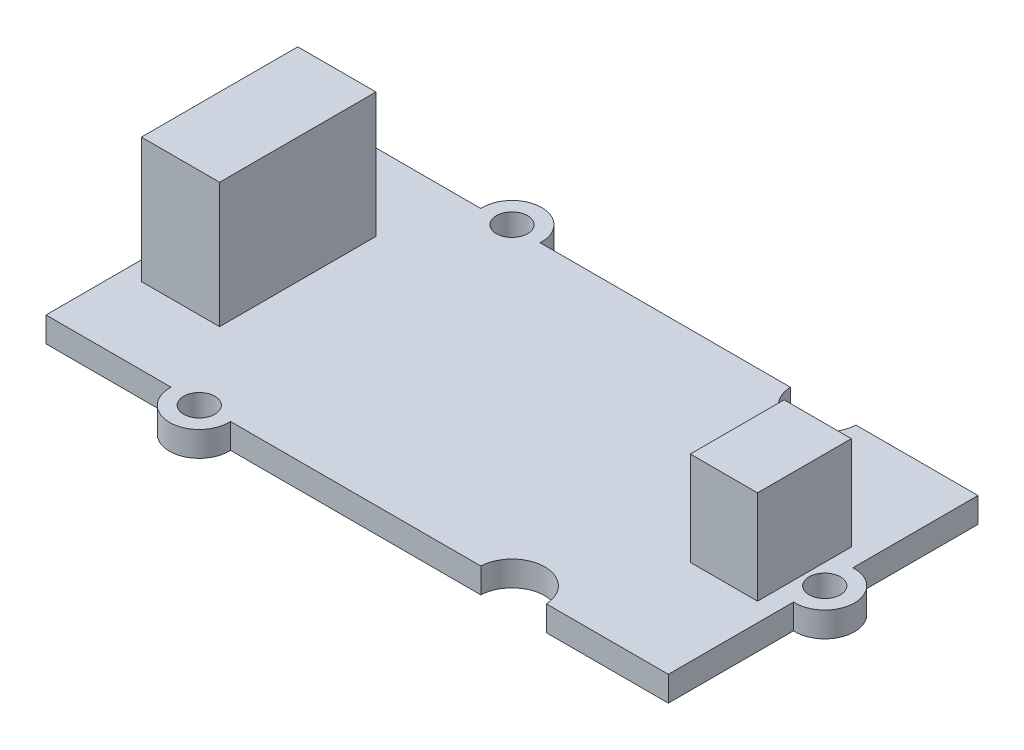
ISO-10303-21;
HEADER;
FILE_DESCRIPTION(('STEP AP214'),'2;1');
FILE_NAME('part.step','',(''),(''),'','','');
FILE_SCHEMA(('AUTOMOTIVE_DESIGN { 1 0 10303 214 1 1 1 1 }'));
ENDSEC;
DATA;
#1=APPLICATION_CONTEXT('core data for automotive mechanical design processes');
#2=APPLICATION_PROTOCOL_DEFINITION('international standard','automotive_design',2000,#1);
#3=PRODUCT_CONTEXT('',#1,'mechanical');
#4=PRODUCT('Part','Part','',(#3));
#5=PRODUCT_RELATED_PRODUCT_CATEGORY('part','',(#4));
#6=PRODUCT_DEFINITION_FORMATION('','',#4);
#7=PRODUCT_DEFINITION_CONTEXT('part definition',#1,'design');
#8=PRODUCT_DEFINITION('design','',#6,#7);
#9=PRODUCT_DEFINITION_SHAPE('','',#8);
#10=(LENGTH_UNIT() NAMED_UNIT(*) SI_UNIT(.MILLI.,.METRE.));
#11=(NAMED_UNIT(*) PLANE_ANGLE_UNIT() SI_UNIT($,.RADIAN.));
#12=(NAMED_UNIT(*) SI_UNIT($,.STERADIAN.) SOLID_ANGLE_UNIT());
#13=UNCERTAINTY_MEASURE_WITH_UNIT(LENGTH_MEASURE(1.E-05),#10,'distance_accuracy_value','');
#14=(GEOMETRIC_REPRESENTATION_CONTEXT(3) GLOBAL_UNCERTAINTY_ASSIGNED_CONTEXT((#13)) GLOBAL_UNIT_ASSIGNED_CONTEXT((#10,
#11,#12)) REPRESENTATION_CONTEXT('',''));
#15=CARTESIAN_POINT('',(0.,0.,0.));
#16=DIRECTION('',(0.,0.,1.));
#17=DIRECTION('',(1.,0.,0.));
#18=AXIS2_PLACEMENT_3D('',#15,#16,#17);
#19=CARTESIAN_POINT('',(0.,1.6,0.));
#20=DIRECTION('',(0.,-1.,0.));
#21=DIRECTION('',(0.,0.,-1.));
#22=AXIS2_PLACEMENT_3D('',#19,#20,#21);
#23=PLANE('',#22);
#24=DIRECTION('',(0.,0.,-1.));
#25=VECTOR('',#24,1.);
#26=CARTESIAN_POINT('',(18.7,1.6,3.));
#27=LINE('',#26,#25);
#28=CARTESIAN_POINT('',(18.7,1.6,3.));
#29=VERTEX_POINT('',#28);
#30=CARTESIAN_POINT('',(18.7,1.6,-3.));
#31=VERTEX_POINT('',#30);
#32=EDGE_CURVE('E227',#29,#31,#27,.T.);
#33=ORIENTED_EDGE('',*,*,#32,.F.);
#34=DIRECTION('',(1.,0.,0.));
#35=VECTOR('',#34,1.);
#36=CARTESIAN_POINT('',(14.4,1.6,3.));
#37=LINE('',#36,#35);
#38=CARTESIAN_POINT('',(14.4,1.6,3.));
#39=VERTEX_POINT('',#38);
#40=EDGE_CURVE('E239',#39,#29,#37,.T.);
#41=ORIENTED_EDGE('',*,*,#40,.F.);
#42=DIRECTION('',(0.,0.,1.));
#43=VECTOR('',#42,1.);
#44=CARTESIAN_POINT('',(14.4,1.6,3.));
#45=LINE('',#44,#43);
#46=CARTESIAN_POINT('',(14.4,1.6,-3.));
#47=VERTEX_POINT('',#46);
#48=EDGE_CURVE('E247',#47,#39,#45,.T.);
#49=ORIENTED_EDGE('',*,*,#48,.F.);
#50=DIRECTION('',(-1.,0.,0.));
#51=VECTOR('',#50,1.);
#52=CARTESIAN_POINT('',(14.4,1.6,-3.));
#53=LINE('',#52,#51);
#54=EDGE_CURVE('E58',#31,#47,#53,.T.);
#55=ORIENTED_EDGE('',*,*,#54,.F.);
#56=EDGE_LOOP('',(#33,#41,#49,#55));
#57=FACE_BOUND('',#56,.T.);
#58=CARTESIAN_POINT('',(-9.99999999999999,1.6,10.));
#59=DIRECTION('',(0.,1.,0.));
#60=DIRECTION('',(0.,0.,1.));
#61=AXIS2_PLACEMENT_3D('',#58,#59,#60);
#62=CIRCLE('',#61,0.999999999999999);
#63=CARTESIAN_POINT('',(-9.99999999999999,1.6,11.));
#64=VERTEX_POINT('',#63);
#65=EDGE_CURVE('E272',#64,#64,#62,.T.);
#66=ORIENTED_EDGE('',*,*,#65,.F.);
#67=EDGE_LOOP('',(#66));
#68=FACE_BOUND('',#67,.T.);
#69=CARTESIAN_POINT('',(20.,1.6,0.));
#70=DIRECTION('',(0.,1.,0.));
#71=DIRECTION('',(0.,0.,1.));
#72=AXIS2_PLACEMENT_3D('',#69,#70,#71);
#73=CIRCLE('',#72,1.);
#74=CARTESIAN_POINT('',(20.,1.6,1.));
#75=VERTEX_POINT('',#74);
#76=EDGE_CURVE('E269',#75,#75,#73,.T.);
#77=ORIENTED_EDGE('',*,*,#76,.F.);
#78=EDGE_LOOP('',(#77));
#79=FACE_BOUND('',#78,.T.);
#80=CARTESIAN_POINT('',(-10.,1.6,-10.));
#81=DIRECTION('',(0.,1.,0.));
#82=DIRECTION('',(0.,0.,1.));
#83=AXIS2_PLACEMENT_3D('',#80,#81,#82);
#84=CIRCLE('',#83,0.999999999999999);
#85=CARTESIAN_POINT('',(-10.,1.6,-9.));
#86=VERTEX_POINT('',#85);
#87=EDGE_CURVE('E279',#86,#86,#84,.T.);
#88=ORIENTED_EDGE('',*,*,#87,.F.);
#89=EDGE_LOOP('',(#88));
#90=FACE_BOUND('',#89,.T.);
#91=DIRECTION('',(0.,0.,1.));
#92=VECTOR('',#91,1.);
#93=CARTESIAN_POINT('',(-18.7,1.6,5.));
#94=LINE('',#93,#92);
#95=CARTESIAN_POINT('',(-18.7,1.6,-5.));
#96=VERTEX_POINT('',#95);
#97=CARTESIAN_POINT('',(-18.7,1.6,-1.64924225024706));
#98=VERTEX_POINT('',#97);
#99=EDGE_CURVE('E50',#96,#98,#94,.T.);
#100=ORIENTED_EDGE('',*,*,#99,.F.);
#101=DIRECTION('',(-1.,0.,0.));
#102=VECTOR('',#101,1.);
#103=CARTESIAN_POINT('',(-18.7,1.6,-5.));
#104=LINE('',#103,#102);
#105=CARTESIAN_POINT('',(-13.7,1.6,-5.));
#106=VERTEX_POINT('',#105);
#107=EDGE_CURVE('E447',#106,#96,#104,.T.);
#108=ORIENTED_EDGE('',*,*,#107,.F.);
#109=DIRECTION('',(0.,0.,-1.));
#110=VECTOR('',#109,1.);
#111=CARTESIAN_POINT('',(-13.7,1.6,5.));
#112=LINE('',#111,#110);
#113=CARTESIAN_POINT('',(-13.7,1.6,5.));
#114=VERTEX_POINT('',#113);
#115=EDGE_CURVE('E225',#114,#106,#112,.T.);
#116=ORIENTED_EDGE('',*,*,#115,.F.);
#117=DIRECTION('',(1.,0.,0.));
#118=VECTOR('',#117,1.);
#119=CARTESIAN_POINT('',(-18.7,1.6,5.));
#120=LINE('',#119,#118);
#121=CARTESIAN_POINT('',(-18.7,1.6,5.));
#122=VERTEX_POINT('',#121);
#123=EDGE_CURVE('E221',#122,#114,#120,.T.);
#124=ORIENTED_EDGE('',*,*,#123,.F.);
#125=CARTESIAN_POINT('',(-18.7,1.6,1.64924225024706));
#126=VERTEX_POINT('',#125);
#127=EDGE_CURVE('E439',#126,#122,#94,.T.);
#128=ORIENTED_EDGE('',*,*,#127,.F.);
#129=CARTESIAN_POINT('',(-20.,1.6,0.));
#130=DIRECTION('',(0.,1.,0.));
#131=DIRECTION('',(0.,0.,1.));
#132=AXIS2_PLACEMENT_3D('',#129,#130,#131);
#133=CIRCLE('',#132,2.1);
#134=CARTESIAN_POINT('',(-19.9,1.6,2.0976176963403));
#135=VERTEX_POINT('',#134);
#136=EDGE_CURVE('E284',#135,#126,#133,.T.);
#137=ORIENTED_EDGE('',*,*,#136,.F.);
#138=DIRECTION('',(0.,0.,1.));
#139=VECTOR('',#138,1.);
#140=CARTESIAN_POINT('',(-19.9,1.6,9.9));
#141=LINE('',#140,#139);
#142=CARTESIAN_POINT('',(-19.9,1.6,9.9));
#143=VERTEX_POINT('',#142);
#144=EDGE_CURVE('E351',#135,#143,#141,.T.);
#145=ORIENTED_EDGE('',*,*,#144,.T.);
#146=DIRECTION('',(1.,0.,0.));
#147=VECTOR('',#146,1.);
#148=CARTESIAN_POINT('',(-19.9,1.6,9.9));
#149=LINE('',#148,#147);
#150=CARTESIAN_POINT('',(-11.897366596101,1.6,9.9));
#151=VERTEX_POINT('',#150);
#152=EDGE_CURVE('E357',#143,#151,#149,.T.);
#153=ORIENTED_EDGE('',*,*,#152,.T.);
#154=CARTESIAN_POINT('',(-9.99999999999999,1.6,10.));
#155=DIRECTION('',(0.,-1.,0.));
#156=DIRECTION('',(0.,0.,-1.));
#157=AXIS2_PLACEMENT_3D('',#154,#155,#156);
#158=CIRCLE('',#157,1.9);
#159=CARTESIAN_POINT('',(-8.10263340389897,1.6,9.9));
#160=VERTEX_POINT('',#159);
#161=EDGE_CURVE('E315',#160,#151,#158,.T.);
#162=ORIENTED_EDGE('',*,*,#161,.F.);
#163=CARTESIAN_POINT('',(7.90238230365969,1.6,9.9));
#164=VERTEX_POINT('',#163);
#165=EDGE_CURVE('E361',#160,#164,#149,.T.);
#166=ORIENTED_EDGE('',*,*,#165,.T.);
#167=CARTESIAN_POINT('',(9.99999999999999,1.6,10.));
#168=DIRECTION('',(0.,1.,0.));
#169=DIRECTION('',(0.,0.,1.));
#170=AXIS2_PLACEMENT_3D('',#167,#168,#169);
#171=CIRCLE('',#170,2.1);
#172=CARTESIAN_POINT('',(12.0976176963403,1.6,9.9));
#173=VERTEX_POINT('',#172);
#174=EDGE_CURVE('E266',#173,#164,#171,.T.);
#175=ORIENTED_EDGE('',*,*,#174,.F.);
#176=CARTESIAN_POINT('',(19.9,1.6,9.9));
#177=VERTEX_POINT('',#176);
#178=EDGE_CURVE('E356',#173,#177,#149,.T.);
#179=ORIENTED_EDGE('',*,*,#178,.T.);
#180=DIRECTION('',(0.,0.,-1.));
#181=VECTOR('',#180,1.);
#182=CARTESIAN_POINT('',(19.9,1.6,9.9));
#183=LINE('',#182,#181);
#184=CARTESIAN_POINT('',(19.9,1.6,1.89736659610103));
#185=VERTEX_POINT('',#184);
#186=EDGE_CURVE('E343',#177,#185,#183,.T.);
#187=ORIENTED_EDGE('',*,*,#186,.T.);
#188=CARTESIAN_POINT('',(20.,1.6,0.));
#189=DIRECTION('',(0.,-1.,0.));
#190=DIRECTION('',(0.,0.,-1.));
#191=AXIS2_PLACEMENT_3D('',#188,#189,#190);
#192=CIRCLE('',#191,1.9);
#193=CARTESIAN_POINT('',(19.9,1.6,-1.89736659610103));
#194=VERTEX_POINT('',#193);
#195=EDGE_CURVE('E324',#194,#185,#192,.T.);
#196=ORIENTED_EDGE('',*,*,#195,.F.);
#197=CARTESIAN_POINT('',(19.9,1.6,-9.9));
#198=VERTEX_POINT('',#197);
#199=EDGE_CURVE('E347',#194,#198,#183,.T.);
#200=ORIENTED_EDGE('',*,*,#199,.T.);
#201=DIRECTION('',(-1.,0.,0.));
#202=VECTOR('',#201,1.);
#203=CARTESIAN_POINT('',(-19.9,1.6,-9.9));
#204=LINE('',#203,#202);
#205=CARTESIAN_POINT('',(12.0976176963403,1.6,-9.9));
#206=VERTEX_POINT('',#205);
#207=EDGE_CURVE('E348',#198,#206,#204,.T.);
#208=ORIENTED_EDGE('',*,*,#207,.T.);
#209=CARTESIAN_POINT('',(10.,1.6,-10.));
#210=DIRECTION('',(0.,1.,0.));
#211=DIRECTION('',(0.,0.,1.));
#212=AXIS2_PLACEMENT_3D('',#209,#210,#211);
#213=CIRCLE('',#212,2.1);
#214=CARTESIAN_POINT('',(7.9023823036597,1.6,-9.9));
#215=VERTEX_POINT('',#214);
#216=EDGE_CURVE('E263',#215,#206,#213,.T.);
#217=ORIENTED_EDGE('',*,*,#216,.F.);
#218=CARTESIAN_POINT('',(-8.10263340389897,1.6,-9.9));
#219=VERTEX_POINT('',#218);
#220=EDGE_CURVE('E352',#215,#219,#204,.T.);
#221=ORIENTED_EDGE('',*,*,#220,.T.);
#222=CARTESIAN_POINT('',(-10.,1.6,-10.));
#223=DIRECTION('',(0.,-1.,0.));
#224=DIRECTION('',(0.,0.,-1.));
#225=AXIS2_PLACEMENT_3D('',#222,#223,#224);
#226=CIRCLE('',#225,1.9);
#227=CARTESIAN_POINT('',(-11.897366596101,1.6,-9.9));
#228=VERTEX_POINT('',#227);
#229=EDGE_CURVE('E333',#228,#219,#226,.T.);
#230=ORIENTED_EDGE('',*,*,#229,.F.);
#231=CARTESIAN_POINT('',(-19.9,1.6,-9.9));
#232=VERTEX_POINT('',#231);
#233=EDGE_CURVE('E346',#228,#232,#204,.T.);
#234=ORIENTED_EDGE('',*,*,#233,.T.);
#235=CARTESIAN_POINT('',(-19.9,1.6,-2.0976176963403));
#236=VERTEX_POINT('',#235);
#237=EDGE_CURVE('E353',#232,#236,#141,.T.);
#238=ORIENTED_EDGE('',*,*,#237,.T.);
#239=EDGE_CURVE('E262',#98,#236,#133,.T.);
#240=ORIENTED_EDGE('',*,*,#239,.F.);
#241=EDGE_LOOP('',(#100,#108,#116,#124,#128,#137,#145,#153,#162,#166,#175,#179,#187,#196,#200,
#208,#217,#221,#230,#234,#238,#240));
#242=FACE_BOUND('',#241,.T.);
#243=ADVANCED_FACE('F35',(#57,#68,#79,#90,#242),#23,.F.);
#244=CARTESIAN_POINT('',(-19.9,1.6,9.9));
#245=DIRECTION('',(0.,0.,-1.));
#246=DIRECTION('',(-1.,0.,0.));
#247=AXIS2_PLACEMENT_3D('',#244,#245,#246);
#248=PLANE('',#247);
#249=DIRECTION('',(1.,0.,0.));
#250=VECTOR('',#249,1.);
#251=CARTESIAN_POINT('',(-19.9,0.,9.9));
#252=LINE('',#251,#250);
#253=CARTESIAN_POINT('',(-8.10263340389897,0.,9.9));
#254=VERTEX_POINT('',#253);
#255=CARTESIAN_POINT('',(7.90238230365969,0.,9.9));
#256=VERTEX_POINT('',#255);
#257=EDGE_CURVE('E378',#254,#256,#252,.T.);
#258=ORIENTED_EDGE('',*,*,#257,.T.);
#259=DIRECTION('',(0.,1.,0.));
#260=VECTOR('',#259,1.);
#261=CARTESIAN_POINT('',(7.90238230365969,-5.939696961967,9.9));
#262=LINE('',#261,#260);
#263=EDGE_CURVE('E298',#256,#164,#262,.T.);
#264=ORIENTED_EDGE('',*,*,#263,.T.);
#265=ORIENTED_EDGE('',*,*,#165,.F.);
#266=DIRECTION('',(0.,-1.,0.));
#267=VECTOR('',#266,1.);
#268=CARTESIAN_POINT('',(-8.10263340389897,6.97401153701776,9.9));
#269=LINE('',#268,#267);
#270=EDGE_CURVE('E319',#254,#160,#269,.F.);
#271=ORIENTED_EDGE('',*,*,#270,.F.);
#272=EDGE_LOOP('',(#258,#264,#265,#271));
#273=FACE_BOUND('',#272,.T.);
#274=ADVANCED_FACE('F467',(#273),#248,.F.);
#275=CARTESIAN_POINT('',(-19.9,1.6,-9.9));
#276=DIRECTION('',(0.,0.,1.));
#277=DIRECTION('',(1.,0.,0.));
#278=AXIS2_PLACEMENT_3D('',#275,#276,#277);
#279=PLANE('',#278);
#280=DIRECTION('',(-1.,0.,0.));
#281=VECTOR('',#280,1.);
#282=CARTESIAN_POINT('',(-19.9,0.,-9.9));
#283=LINE('',#282,#281);
#284=CARTESIAN_POINT('',(19.9,0.,-9.9));
#285=VERTEX_POINT('',#284);
#286=CARTESIAN_POINT('',(12.0976176963403,0.,-9.9));
#287=VERTEX_POINT('',#286);
#288=EDGE_CURVE('E366',#285,#287,#283,.T.);
#289=ORIENTED_EDGE('',*,*,#288,.T.);
#290=DIRECTION('',(0.,1.,0.));
#291=VECTOR('',#290,1.);
#292=CARTESIAN_POINT('',(12.0976176963403,-5.939696961967,-9.9));
#293=LINE('',#292,#291);
#294=EDGE_CURVE('E304',#287,#206,#293,.T.);
#295=ORIENTED_EDGE('',*,*,#294,.T.);
#296=ORIENTED_EDGE('',*,*,#207,.F.);
#297=DIRECTION('',(0.,-1.,0.));
#298=VECTOR('',#297,1.);
#299=CARTESIAN_POINT('',(19.9,1.6,-9.9));
#300=LINE('',#299,#298);
#301=EDGE_CURVE('E43',#198,#285,#300,.T.);
#302=ORIENTED_EDGE('',*,*,#301,.T.);
#303=EDGE_LOOP('',(#289,#295,#296,#302));
#304=FACE_BOUND('',#303,.T.);
#305=ADVANCED_FACE('F390',(#304),#279,.F.);
#306=CARTESIAN_POINT('',(-19.9,1.6,9.9));
#307=DIRECTION('',(1.,0.,0.));
#308=DIRECTION('',(0.,0.,-1.));
#309=AXIS2_PLACEMENT_3D('',#306,#307,#308);
#310=PLANE('',#309);
#311=DIRECTION('',(0.,0.,1.));
#312=VECTOR('',#311,1.);
#313=CARTESIAN_POINT('',(-19.9,0.,9.9));
#314=LINE('',#313,#312);
#315=CARTESIAN_POINT('',(-19.9,0.,-9.9));
#316=VERTEX_POINT('',#315);
#317=CARTESIAN_POINT('',(-19.9,0.,-2.0976176963403));
#318=VERTEX_POINT('',#317);
#319=EDGE_CURVE('E371',#316,#318,#314,.T.);
#320=ORIENTED_EDGE('',*,*,#319,.T.);
#321=DIRECTION('',(0.,1.,0.));
#322=VECTOR('',#321,1.);
#323=CARTESIAN_POINT('',(-19.9,-5.939696961967,-2.0976176963403));
#324=LINE('',#323,#322);
#325=EDGE_CURVE('E310',#318,#236,#324,.T.);
#326=ORIENTED_EDGE('',*,*,#325,.T.);
#327=ORIENTED_EDGE('',*,*,#237,.F.);
#328=DIRECTION('',(0.,-1.,0.));
#329=VECTOR('',#328,1.);
#330=CARTESIAN_POINT('',(-19.9,1.6,-9.9));
#331=LINE('',#330,#329);
#332=EDGE_CURVE('E384',#232,#316,#331,.T.);
#333=ORIENTED_EDGE('',*,*,#332,.T.);
#334=EDGE_LOOP('',(#320,#326,#327,#333));
#335=FACE_BOUND('',#334,.T.);
#336=ADVANCED_FACE('F420',(#335),#310,.F.);
#337=ORIENTED_EDGE('',*,*,#178,.F.);
#338=DIRECTION('',(0.,1.,0.));
#339=VECTOR('',#338,1.);
#340=CARTESIAN_POINT('',(12.0976176963403,-5.939696961967,9.9));
#341=LINE('',#340,#339);
#342=CARTESIAN_POINT('',(12.0976176963403,0.,9.9));
#343=VERTEX_POINT('',#342);
#344=EDGE_CURVE('E295',#173,#343,#341,.F.);
#345=ORIENTED_EDGE('',*,*,#344,.T.);
#346=CARTESIAN_POINT('',(19.9,0.,9.9));
#347=VERTEX_POINT('',#346);
#348=EDGE_CURVE('E374',#343,#347,#252,.T.);
#349=ORIENTED_EDGE('',*,*,#348,.T.);
#350=DIRECTION('',(0.,-1.,0.));
#351=VECTOR('',#350,1.);
#352=CARTESIAN_POINT('',(19.9,1.6,9.9));
#353=LINE('',#352,#351);
#354=EDGE_CURVE('E360',#177,#347,#353,.T.);
#355=ORIENTED_EDGE('',*,*,#354,.F.);
#356=EDGE_LOOP('',(#337,#345,#349,#355));
#357=FACE_BOUND('',#356,.T.);
#358=ADVANCED_FACE('F474',(#357),#248,.F.);
#359=DIRECTION('',(0.,-1.,0.));
#360=VECTOR('',#359,1.);
#361=CARTESIAN_POINT('',(-11.897366596101,6.97401153701776,9.9));
#362=LINE('',#361,#360);
#363=CARTESIAN_POINT('',(-11.897366596101,0.,9.9));
#364=VERTEX_POINT('',#363);
#365=EDGE_CURVE('E317',#151,#364,#362,.T.);
#366=ORIENTED_EDGE('',*,*,#365,.F.);
#367=ORIENTED_EDGE('',*,*,#152,.F.);
#368=DIRECTION('',(0.,-1.,0.));
#369=VECTOR('',#368,1.);
#370=CARTESIAN_POINT('',(-19.9,1.6,9.9));
#371=LINE('',#370,#369);
#372=CARTESIAN_POINT('',(-19.9,0.,9.9));
#373=VERTEX_POINT('',#372);
#374=EDGE_CURVE('E381',#143,#373,#371,.T.);
#375=ORIENTED_EDGE('',*,*,#374,.T.);
#376=EDGE_CURVE('E375',#373,#364,#252,.T.);
#377=ORIENTED_EDGE('',*,*,#376,.T.);
#378=EDGE_LOOP('',(#366,#367,#375,#377));
#379=FACE_BOUND('',#378,.T.);
#380=ADVANCED_FACE('F434',(#379),#248,.F.);
#381=CARTESIAN_POINT('',(19.9,1.6,9.9));
#382=DIRECTION('',(-1.,0.,0.));
#383=DIRECTION('',(0.,0.,1.));
#384=AXIS2_PLACEMENT_3D('',#381,#382,#383);
#385=PLANE('',#384);
#386=DIRECTION('',(0.,-1.,0.));
#387=VECTOR('',#386,1.);
#388=CARTESIAN_POINT('',(19.9,6.97401153701776,-1.89736659610103));
#389=LINE('',#388,#387);
#390=CARTESIAN_POINT('',(19.9,0.,-1.89736659610103));
#391=VERTEX_POINT('',#390);
#392=EDGE_CURVE('E328',#391,#194,#389,.F.);
#393=ORIENTED_EDGE('',*,*,#392,.F.);
#394=DIRECTION('',(0.,0.,-1.));
#395=VECTOR('',#394,1.);
#396=CARTESIAN_POINT('',(19.9,0.,9.9));
#397=LINE('',#396,#395);
#398=EDGE_CURVE('E342',#391,#285,#397,.T.);
#399=ORIENTED_EDGE('',*,*,#398,.T.);
#400=ORIENTED_EDGE('',*,*,#301,.F.);
#401=ORIENTED_EDGE('',*,*,#199,.F.);
#402=EDGE_LOOP('',(#393,#399,#400,#401));
#403=FACE_BOUND('',#402,.T.);
#404=ADVANCED_FACE('F37',(#403),#385,.F.);
#405=DIRECTION('',(0.,-1.,0.));
#406=VECTOR('',#405,1.);
#407=CARTESIAN_POINT('',(19.9,6.97401153701776,1.89736659610103));
#408=LINE('',#407,#406);
#409=CARTESIAN_POINT('',(19.9,0.,1.89736659610103));
#410=VERTEX_POINT('',#409);
#411=EDGE_CURVE('E326',#185,#410,#408,.T.);
#412=ORIENTED_EDGE('',*,*,#411,.F.);
#413=ORIENTED_EDGE('',*,*,#186,.F.);
#414=ORIENTED_EDGE('',*,*,#354,.T.);
#415=EDGE_CURVE('E362',#347,#410,#397,.T.);
#416=ORIENTED_EDGE('',*,*,#415,.T.);
#417=EDGE_LOOP('',(#412,#413,#414,#416));
#418=FACE_BOUND('',#417,.T.);
#419=ADVANCED_FACE('F486',(#418),#385,.F.);
#420=DIRECTION('',(0.,-1.,0.));
#421=VECTOR('',#420,1.);
#422=CARTESIAN_POINT('',(-11.897366596101,6.97401153701776,-9.9));
#423=LINE('',#422,#421);
#424=CARTESIAN_POINT('',(-11.897366596101,0.,-9.9));
#425=VERTEX_POINT('',#424);
#426=EDGE_CURVE('E339',#425,#228,#423,.F.);
#427=ORIENTED_EDGE('',*,*,#426,.F.);
#428=EDGE_CURVE('E365',#425,#316,#283,.T.);
#429=ORIENTED_EDGE('',*,*,#428,.T.);
#430=ORIENTED_EDGE('',*,*,#332,.F.);
#431=ORIENTED_EDGE('',*,*,#233,.F.);
#432=EDGE_LOOP('',(#427,#429,#430,#431));
#433=FACE_BOUND('',#432,.T.);
#434=ADVANCED_FACE('F416',(#433),#279,.F.);
#435=ORIENTED_EDGE('',*,*,#220,.F.);
#436=DIRECTION('',(0.,1.,0.));
#437=VECTOR('',#436,1.);
#438=CARTESIAN_POINT('',(7.9023823036597,-5.939696961967,-9.9));
#439=LINE('',#438,#437);
#440=CARTESIAN_POINT('',(7.9023823036597,0.,-9.9));
#441=VERTEX_POINT('',#440);
#442=EDGE_CURVE('E301',#215,#441,#439,.F.);
#443=ORIENTED_EDGE('',*,*,#442,.T.);
#444=CARTESIAN_POINT('',(-8.10263340389897,0.,-9.9));
#445=VERTEX_POINT('',#444);
#446=EDGE_CURVE('E370',#441,#445,#283,.T.);
#447=ORIENTED_EDGE('',*,*,#446,.T.);
#448=DIRECTION('',(0.,-1.,0.));
#449=VECTOR('',#448,1.);
#450=CARTESIAN_POINT('',(-8.10263340389897,6.97401153701776,-9.9));
#451=LINE('',#450,#449);
#452=EDGE_CURVE('E336',#219,#445,#451,.T.);
#453=ORIENTED_EDGE('',*,*,#452,.F.);
#454=EDGE_LOOP('',(#435,#443,#447,#453));
#455=FACE_BOUND('',#454,.T.);
#456=ADVANCED_FACE('F407',(#455),#279,.F.);
#457=ORIENTED_EDGE('',*,*,#144,.F.);
#458=DIRECTION('',(0.,1.,0.));
#459=VECTOR('',#458,1.);
#460=CARTESIAN_POINT('',(-19.9,-5.939696961967,2.0976176963403));
#461=LINE('',#460,#459);
#462=CARTESIAN_POINT('',(-19.9,0.,2.0976176963403));
#463=VERTEX_POINT('',#462);
#464=EDGE_CURVE('E307',#135,#463,#461,.F.);
#465=ORIENTED_EDGE('',*,*,#464,.T.);
#466=EDGE_CURVE('E369',#463,#373,#314,.T.);
#467=ORIENTED_EDGE('',*,*,#466,.T.);
#468=ORIENTED_EDGE('',*,*,#374,.F.);
#469=EDGE_LOOP('',(#457,#465,#467,#468));
#470=FACE_BOUND('',#469,.T.);
#471=ADVANCED_FACE('F430',(#470),#310,.F.);
#472=CARTESIAN_POINT('',(0.,0.,0.));
#473=DIRECTION('',(0.,-1.,0.));
#474=DIRECTION('',(0.,0.,-1.));
#475=AXIS2_PLACEMENT_3D('',#472,#473,#474);
#476=PLANE('',#475);
#477=CARTESIAN_POINT('',(-20.,0.,0.));
#478=DIRECTION('',(0.,-1.,0.));
#479=DIRECTION('',(0.,0.,-1.));
#480=AXIS2_PLACEMENT_3D('',#477,#478,#479);
#481=CIRCLE('',#480,2.1);
#482=EDGE_CURVE('E271',#463,#318,#481,.F.);
#483=ORIENTED_EDGE('',*,*,#482,.T.);
#484=ORIENTED_EDGE('',*,*,#319,.F.);
#485=ORIENTED_EDGE('',*,*,#428,.F.);
#486=CARTESIAN_POINT('',(-10.,0.,-10.));
#487=DIRECTION('',(0.,1.,0.));
#488=DIRECTION('',(0.,0.,1.));
#489=AXIS2_PLACEMENT_3D('',#486,#487,#488);
#490=CIRCLE('',#489,1.9);
#491=EDGE_CURVE('E331',#445,#425,#490,.T.);
#492=ORIENTED_EDGE('',*,*,#491,.F.);
#493=ORIENTED_EDGE('',*,*,#446,.F.);
#494=CARTESIAN_POINT('',(10.,0.,-10.));
#495=DIRECTION('',(0.,-1.,0.));
#496=DIRECTION('',(0.,0.,-1.));
#497=AXIS2_PLACEMENT_3D('',#494,#495,#496);
#498=CIRCLE('',#497,2.1);
#499=EDGE_CURVE('E265',#441,#287,#498,.F.);
#500=ORIENTED_EDGE('',*,*,#499,.T.);
#501=ORIENTED_EDGE('',*,*,#288,.F.);
#502=ORIENTED_EDGE('',*,*,#398,.F.);
#503=CARTESIAN_POINT('',(20.,0.,0.));
#504=DIRECTION('',(0.,1.,0.));
#505=DIRECTION('',(0.,0.,1.));
#506=AXIS2_PLACEMENT_3D('',#503,#504,#505);
#507=CIRCLE('',#506,1.9);
#508=EDGE_CURVE('E322',#410,#391,#507,.T.);
#509=ORIENTED_EDGE('',*,*,#508,.F.);
#510=ORIENTED_EDGE('',*,*,#415,.F.);
#511=ORIENTED_EDGE('',*,*,#348,.F.);
#512=CARTESIAN_POINT('',(9.99999999999999,0.,10.));
#513=DIRECTION('',(0.,-1.,0.));
#514=DIRECTION('',(0.,0.,-1.));
#515=AXIS2_PLACEMENT_3D('',#512,#513,#514);
#516=CIRCLE('',#515,2.1);
#517=EDGE_CURVE('E11',#256,#343,#516,.T.);
#518=ORIENTED_EDGE('',*,*,#517,.F.);
#519=ORIENTED_EDGE('',*,*,#257,.F.);
#520=CARTESIAN_POINT('',(-9.99999999999999,0.,10.));
#521=DIRECTION('',(0.,1.,0.));
#522=DIRECTION('',(0.,0.,-1.));
#523=AXIS2_PLACEMENT_3D('',#520,#521,#522);
#524=CIRCLE('',#523,1.9);
#525=EDGE_CURVE('E313',#364,#254,#524,.T.);
#526=ORIENTED_EDGE('',*,*,#525,.F.);
#527=ORIENTED_EDGE('',*,*,#376,.F.);
#528=ORIENTED_EDGE('',*,*,#466,.F.);
#529=EDGE_LOOP('',(#483,#484,#485,#492,#493,#500,#501,#502,#509,#510,#511,#518,#519,#526,#527,#528));
#530=FACE_BOUND('',#529,.T.);
#531=CARTESIAN_POINT('',(-9.99999999999999,0.,10.));
#532=DIRECTION('',(0.,-1.,0.));
#533=DIRECTION('',(0.,0.,-1.));
#534=AXIS2_PLACEMENT_3D('',#531,#532,#533);
#535=CIRCLE('',#534,0.999999999999999);
#536=CARTESIAN_POINT('',(-9.99999999999999,0.,9.));
#537=VERTEX_POINT('',#536);
#538=EDGE_CURVE('E275',#537,#537,#535,.F.);
#539=ORIENTED_EDGE('',*,*,#538,.T.);
#540=EDGE_LOOP('',(#539));
#541=FACE_BOUND('',#540,.T.);
#542=CARTESIAN_POINT('',(20.,0.,0.));
#543=DIRECTION('',(0.,-1.,0.));
#544=DIRECTION('',(0.,0.,-1.));
#545=AXIS2_PLACEMENT_3D('',#542,#543,#544);
#546=CIRCLE('',#545,1.);
#547=CARTESIAN_POINT('',(20.,0.,-1.));
#548=VERTEX_POINT('',#547);
#549=EDGE_CURVE('E276',#548,#548,#546,.F.);
#550=ORIENTED_EDGE('',*,*,#549,.T.);
#551=EDGE_LOOP('',(#550));
#552=FACE_BOUND('',#551,.T.);
#553=CARTESIAN_POINT('',(-10.,0.,-10.));
#554=DIRECTION('',(0.,-1.,0.));
#555=DIRECTION('',(0.,0.,-1.));
#556=AXIS2_PLACEMENT_3D('',#553,#554,#555);
#557=CIRCLE('',#556,0.999999999999999);
#558=CARTESIAN_POINT('',(-10.,0.,-11.));
#559=VERTEX_POINT('',#558);
#560=EDGE_CURVE('E292',#559,#559,#557,.F.);
#561=ORIENTED_EDGE('',*,*,#560,.T.);
#562=EDGE_LOOP('',(#561));
#563=FACE_BOUND('',#562,.T.);
#564=ADVANCED_FACE('F398',(#530,#541,#552,#563),#476,.T.);
#565=CARTESIAN_POINT('',(-10.,6.97401153701776,-10.));
#566=DIRECTION('',(0.,-1.,0.));
#567=DIRECTION('',(0.,0.,-1.));
#568=AXIS2_PLACEMENT_3D('',#565,#566,#567);
#569=CYLINDRICAL_SURFACE('',#568,1.9);
#570=ORIENTED_EDGE('',*,*,#491,.T.);
#571=ORIENTED_EDGE('',*,*,#426,.T.);
#572=ORIENTED_EDGE('',*,*,#229,.T.);
#573=ORIENTED_EDGE('',*,*,#452,.T.);
#574=EDGE_LOOP('',(#570,#571,#572,#573));
#575=FACE_BOUND('',#574,.T.);
#576=ADVANCED_FACE('F478',(#575),#569,.T.);
#577=CARTESIAN_POINT('',(20.,6.97401153701776,0.));
#578=DIRECTION('',(0.,-1.,0.));
#579=DIRECTION('',(0.,0.,-1.));
#580=AXIS2_PLACEMENT_3D('',#577,#578,#579);
#581=CYLINDRICAL_SURFACE('',#580,1.9);
#582=ORIENTED_EDGE('',*,*,#508,.T.);
#583=ORIENTED_EDGE('',*,*,#392,.T.);
#584=ORIENTED_EDGE('',*,*,#195,.T.);
#585=ORIENTED_EDGE('',*,*,#411,.T.);
#586=EDGE_LOOP('',(#582,#583,#584,#585));
#587=FACE_BOUND('',#586,.T.);
#588=ADVANCED_FACE('F531',(#587),#581,.T.);
#589=CARTESIAN_POINT('',(-9.99999999999999,6.97401153701776,10.));
#590=DIRECTION('',(0.,-1.,0.));
#591=DIRECTION('',(0.,0.,-1.));
#592=AXIS2_PLACEMENT_3D('',#589,#590,#591);
#593=CYLINDRICAL_SURFACE('',#592,1.9);
#594=ORIENTED_EDGE('',*,*,#525,.T.);
#595=ORIENTED_EDGE('',*,*,#270,.T.);
#596=ORIENTED_EDGE('',*,*,#161,.T.);
#597=ORIENTED_EDGE('',*,*,#365,.T.);
#598=EDGE_LOOP('',(#594,#595,#596,#597));
#599=FACE_BOUND('',#598,.T.);
#600=ADVANCED_FACE('F541',(#599),#593,.T.);
#601=CARTESIAN_POINT('',(-10.,-5.939696961967,-10.));
#602=DIRECTION('',(0.,1.,0.));
#603=DIRECTION('',(0.,0.,1.));
#604=AXIS2_PLACEMENT_3D('',#601,#602,#603);
#605=CYLINDRICAL_SURFACE('',#604,0.999999999999999);
#606=ORIENTED_EDGE('',*,*,#87,.T.);
#607=EDGE_LOOP('',(#606));
#608=FACE_BOUND('',#607,.T.);
#609=ORIENTED_EDGE('',*,*,#560,.F.);
#610=EDGE_LOOP('',(#609));
#611=FACE_BOUND('',#610,.T.);
#612=ADVANCED_FACE('F550',(#608,#611),#605,.F.);
#613=CARTESIAN_POINT('',(9.99999999999999,-5.939696961967,10.));
#614=DIRECTION('',(0.,1.,0.));
#615=DIRECTION('',(0.,0.,1.));
#616=AXIS2_PLACEMENT_3D('',#613,#614,#615);
#617=CYLINDRICAL_SURFACE('',#616,2.1);
#618=ORIENTED_EDGE('',*,*,#517,.T.);
#619=ORIENTED_EDGE('',*,*,#344,.F.);
#620=ORIENTED_EDGE('',*,*,#174,.T.);
#621=ORIENTED_EDGE('',*,*,#263,.F.);
#622=EDGE_LOOP('',(#618,#619,#620,#621));
#623=FACE_BOUND('',#622,.T.);
#624=ADVANCED_FACE('F573',(#623),#617,.F.);
#625=CARTESIAN_POINT('',(10.,-5.939696961967,-10.));
#626=DIRECTION('',(0.,1.,0.));
#627=DIRECTION('',(0.,0.,1.));
#628=AXIS2_PLACEMENT_3D('',#625,#626,#627);
#629=CYLINDRICAL_SURFACE('',#628,2.1);
#630=ORIENTED_EDGE('',*,*,#499,.F.);
#631=ORIENTED_EDGE('',*,*,#442,.F.);
#632=ORIENTED_EDGE('',*,*,#216,.T.);
#633=ORIENTED_EDGE('',*,*,#294,.F.);
#634=EDGE_LOOP('',(#630,#631,#632,#633));
#635=FACE_BOUND('',#634,.T.);
#636=ADVANCED_FACE('F403',(#635),#629,.F.);
#637=CARTESIAN_POINT('',(20.,-5.939696961967,0.));
#638=DIRECTION('',(0.,1.,0.));
#639=DIRECTION('',(0.,0.,1.));
#640=AXIS2_PLACEMENT_3D('',#637,#638,#639);
#641=CYLINDRICAL_SURFACE('',#640,1.);
#642=ORIENTED_EDGE('',*,*,#76,.T.);
#643=EDGE_LOOP('',(#642));
#644=FACE_BOUND('',#643,.T.);
#645=ORIENTED_EDGE('',*,*,#549,.F.);
#646=EDGE_LOOP('',(#645));
#647=FACE_BOUND('',#646,.T.);
#648=ADVANCED_FACE('F591',(#644,#647),#641,.F.);
#649=CARTESIAN_POINT('',(-9.99999999999999,-5.939696961967,10.));
#650=DIRECTION('',(0.,1.,0.));
#651=DIRECTION('',(0.,0.,1.));
#652=AXIS2_PLACEMENT_3D('',#649,#650,#651);
#653=CYLINDRICAL_SURFACE('',#652,0.999999999999999);
#654=ORIENTED_EDGE('',*,*,#65,.T.);
#655=EDGE_LOOP('',(#654));
#656=FACE_BOUND('',#655,.T.);
#657=ORIENTED_EDGE('',*,*,#538,.F.);
#658=EDGE_LOOP('',(#657));
#659=FACE_BOUND('',#658,.T.);
#660=ADVANCED_FACE('F599',(#656,#659),#653,.F.);
#661=CARTESIAN_POINT('',(-20.,-5.939696961967,0.));
#662=DIRECTION('',(0.,1.,0.));
#663=DIRECTION('',(0.,0.,1.));
#664=AXIS2_PLACEMENT_3D('',#661,#662,#663);
#665=CYLINDRICAL_SURFACE('',#664,2.1);
#666=ORIENTED_EDGE('',*,*,#482,.F.);
#667=ORIENTED_EDGE('',*,*,#464,.F.);
#668=ORIENTED_EDGE('',*,*,#136,.T.);
#669=EDGE_CURVE('E287',#126,#98,#133,.T.);
#670=ORIENTED_EDGE('',*,*,#669,.T.);
#671=ORIENTED_EDGE('',*,*,#239,.T.);
#672=ORIENTED_EDGE('',*,*,#325,.F.);
#673=EDGE_LOOP('',(#666,#667,#668,#670,#671,#672));
#674=FACE_BOUND('',#673,.T.);
#675=ADVANCED_FACE('F422',(#674),#665,.F.);
#676=CARTESIAN_POINT('',(18.7,7.6,3.));
#677=DIRECTION('',(-1.,0.,0.));
#678=DIRECTION('',(0.,0.,1.));
#679=AXIS2_PLACEMENT_3D('',#676,#677,#678);
#680=PLANE('',#679);
#681=ORIENTED_EDGE('',*,*,#32,.T.);
#682=DIRECTION('',(0.,-1.,0.));
#683=VECTOR('',#682,1.);
#684=CARTESIAN_POINT('',(18.7,7.6,-3.));
#685=LINE('',#684,#683);
#686=CARTESIAN_POINT('',(18.7,7.6,-3.));
#687=VERTEX_POINT('',#686);
#688=EDGE_CURVE('E260',#687,#31,#685,.T.);
#689=ORIENTED_EDGE('',*,*,#688,.F.);
#690=DIRECTION('',(0.,0.,-1.));
#691=VECTOR('',#690,1.);
#692=CARTESIAN_POINT('',(18.7,7.6,3.));
#693=LINE('',#692,#691);
#694=CARTESIAN_POINT('',(18.7,7.6,3.));
#695=VERTEX_POINT('',#694);
#696=EDGE_CURVE('E235',#695,#687,#693,.T.);
#697=ORIENTED_EDGE('',*,*,#696,.F.);
#698=DIRECTION('',(0.,-1.,0.));
#699=VECTOR('',#698,1.);
#700=CARTESIAN_POINT('',(18.7,7.6,3.));
#701=LINE('',#700,#699);
#702=EDGE_CURVE('E244',#695,#29,#701,.T.);
#703=ORIENTED_EDGE('',*,*,#702,.T.);
#704=EDGE_LOOP('',(#681,#689,#697,#703));
#705=FACE_BOUND('',#704,.T.);
#706=ADVANCED_FACE('F617',(#705),#680,.F.);
#707=CARTESIAN_POINT('',(14.4,7.6,-3.));
#708=DIRECTION('',(0.,0.,1.));
#709=DIRECTION('',(1.,0.,0.));
#710=AXIS2_PLACEMENT_3D('',#707,#708,#709);
#711=PLANE('',#710);
#712=ORIENTED_EDGE('',*,*,#54,.T.);
#713=DIRECTION('',(0.,-1.,0.));
#714=VECTOR('',#713,1.);
#715=CARTESIAN_POINT('',(14.4,7.6,-3.));
#716=LINE('',#715,#714);
#717=CARTESIAN_POINT('',(14.4,7.6,-3.));
#718=VERTEX_POINT('',#717);
#719=EDGE_CURVE('E257',#718,#47,#716,.T.);
#720=ORIENTED_EDGE('',*,*,#719,.F.);
#721=DIRECTION('',(-1.,0.,0.));
#722=VECTOR('',#721,1.);
#723=CARTESIAN_POINT('',(14.4,7.6,-3.));
#724=LINE('',#723,#722);
#725=EDGE_CURVE('E238',#687,#718,#724,.T.);
#726=ORIENTED_EDGE('',*,*,#725,.F.);
#727=ORIENTED_EDGE('',*,*,#688,.T.);
#728=EDGE_LOOP('',(#712,#720,#726,#727));
#729=FACE_BOUND('',#728,.T.);
#730=ADVANCED_FACE('F625',(#729),#711,.F.);
#731=CARTESIAN_POINT('',(14.4,7.6,3.));
#732=DIRECTION('',(1.,0.,0.));
#733=DIRECTION('',(0.,0.,-1.));
#734=AXIS2_PLACEMENT_3D('',#731,#732,#733);
#735=PLANE('',#734);
#736=ORIENTED_EDGE('',*,*,#48,.T.);
#737=DIRECTION('',(0.,-1.,0.));
#738=VECTOR('',#737,1.);
#739=CARTESIAN_POINT('',(14.4,7.6,3.));
#740=LINE('',#739,#738);
#741=CARTESIAN_POINT('',(14.4,7.6,3.));
#742=VERTEX_POINT('',#741);
#743=EDGE_CURVE('E254',#742,#39,#740,.T.);
#744=ORIENTED_EDGE('',*,*,#743,.F.);
#745=DIRECTION('',(0.,0.,1.));
#746=VECTOR('',#745,1.);
#747=CARTESIAN_POINT('',(14.4,7.6,3.));
#748=LINE('',#747,#746);
#749=EDGE_CURVE('E241',#718,#742,#748,.T.);
#750=ORIENTED_EDGE('',*,*,#749,.F.);
#751=ORIENTED_EDGE('',*,*,#719,.T.);
#752=EDGE_LOOP('',(#736,#744,#750,#751));
#753=FACE_BOUND('',#752,.T.);
#754=ADVANCED_FACE('F634',(#753),#735,.F.);
#755=CARTESIAN_POINT('',(14.4,7.6,3.));
#756=DIRECTION('',(0.,0.,-1.));
#757=DIRECTION('',(-1.,0.,0.));
#758=AXIS2_PLACEMENT_3D('',#755,#756,#757);
#759=PLANE('',#758);
#760=ORIENTED_EDGE('',*,*,#40,.T.);
#761=ORIENTED_EDGE('',*,*,#702,.F.);
#762=DIRECTION('',(1.,0.,0.));
#763=VECTOR('',#762,1.);
#764=CARTESIAN_POINT('',(14.4,7.6,3.));
#765=LINE('',#764,#763);
#766=EDGE_CURVE('E243',#742,#695,#765,.T.);
#767=ORIENTED_EDGE('',*,*,#766,.F.);
#768=ORIENTED_EDGE('',*,*,#743,.T.);
#769=EDGE_LOOP('',(#760,#761,#767,#768));
#770=FACE_BOUND('',#769,.T.);
#771=ADVANCED_FACE('F643',(#770),#759,.F.);
#772=CARTESIAN_POINT('',(0.,7.6,0.));
#773=DIRECTION('',(0.,-1.,0.));
#774=DIRECTION('',(0.,0.,-1.));
#775=AXIS2_PLACEMENT_3D('',#772,#773,#774);
#776=PLANE('',#775);
#777=ORIENTED_EDGE('',*,*,#696,.T.);
#778=ORIENTED_EDGE('',*,*,#725,.T.);
#779=ORIENTED_EDGE('',*,*,#749,.T.);
#780=ORIENTED_EDGE('',*,*,#766,.T.);
#781=EDGE_LOOP('',(#777,#778,#779,#780));
#782=FACE_BOUND('',#781,.T.);
#783=ADVANCED_FACE('F652',(#782),#776,.F.);
#784=CARTESIAN_POINT('',(0.,1.6,0.));
#785=DIRECTION('',(0.,-1.,0.));
#786=DIRECTION('',(0.,0.,-1.));
#787=AXIS2_PLACEMENT_3D('',#784,#785,#786);
#788=PLANE('',#787);
#789=ORIENTED_EDGE('',*,*,#669,.F.);
#790=EDGE_CURVE('E442',#98,#126,#94,.T.);
#791=ORIENTED_EDGE('',*,*,#790,.F.);
#792=EDGE_LOOP('',(#789,#791));
#793=FACE_BOUND('',#792,.T.);
#794=ADVANCED_FACE('F441',(#793),#788,.T.);
#795=CARTESIAN_POINT('',(-13.7,9.6,5.));
#796=DIRECTION('',(-1.,0.,0.));
#797=DIRECTION('',(0.,0.,1.));
#798=AXIS2_PLACEMENT_3D('',#795,#796,#797);
#799=PLANE('',#798);
#800=ORIENTED_EDGE('',*,*,#115,.T.);
#801=DIRECTION('',(0.,-1.,0.));
#802=VECTOR('',#801,1.);
#803=CARTESIAN_POINT('',(-13.7,9.6,-5.));
#804=LINE('',#803,#802);
#805=CARTESIAN_POINT('',(-13.7,9.6,-5.));
#806=VERTEX_POINT('',#805);
#807=EDGE_CURVE('E206',#806,#106,#804,.T.);
#808=ORIENTED_EDGE('',*,*,#807,.F.);
#809=DIRECTION('',(0.,0.,-1.));
#810=VECTOR('',#809,1.);
#811=CARTESIAN_POINT('',(-13.7,9.6,5.));
#812=LINE('',#811,#810);
#813=CARTESIAN_POINT('',(-13.7,9.6,5.));
#814=VERTEX_POINT('',#813);
#815=EDGE_CURVE('E212',#814,#806,#812,.T.);
#816=ORIENTED_EDGE('',*,*,#815,.F.);
#817=DIRECTION('',(0.,-1.,0.));
#818=VECTOR('',#817,1.);
#819=CARTESIAN_POINT('',(-13.7,9.6,5.));
#820=LINE('',#819,#818);
#821=EDGE_CURVE('E452',#814,#114,#820,.T.);
#822=ORIENTED_EDGE('',*,*,#821,.T.);
#823=EDGE_LOOP('',(#800,#808,#816,#822));
#824=FACE_BOUND('',#823,.T.);
#825=ADVANCED_FACE('F223',(#824),#799,.F.);
#826=CARTESIAN_POINT('',(-18.7,9.6,-5.));
#827=DIRECTION('',(0.,0.,1.));
#828=DIRECTION('',(1.,0.,0.));
#829=AXIS2_PLACEMENT_3D('',#826,#827,#828);
#830=PLANE('',#829);
#831=ORIENTED_EDGE('',*,*,#107,.T.);
#832=DIRECTION('',(0.,-1.,0.));
#833=VECTOR('',#832,1.);
#834=CARTESIAN_POINT('',(-18.7,9.6,-5.));
#835=LINE('',#834,#833);
#836=CARTESIAN_POINT('',(-18.7,9.6,-5.));
#837=VERTEX_POINT('',#836);
#838=EDGE_CURVE('E208',#837,#96,#835,.T.);
#839=ORIENTED_EDGE('',*,*,#838,.F.);
#840=DIRECTION('',(-1.,0.,0.));
#841=VECTOR('',#840,1.);
#842=CARTESIAN_POINT('',(-18.7,9.6,-5.));
#843=LINE('',#842,#841);
#844=EDGE_CURVE('E202',#806,#837,#843,.T.);
#845=ORIENTED_EDGE('',*,*,#844,.F.);
#846=ORIENTED_EDGE('',*,*,#807,.T.);
#847=EDGE_LOOP('',(#831,#839,#845,#846));
#848=FACE_BOUND('',#847,.T.);
#849=ADVANCED_FACE('F204',(#848),#830,.F.);
#850=CARTESIAN_POINT('',(-18.7,9.6,5.));
#851=DIRECTION('',(1.,0.,0.));
#852=DIRECTION('',(0.,0.,-1.));
#853=AXIS2_PLACEMENT_3D('',#850,#851,#852);
#854=PLANE('',#853);
#855=ORIENTED_EDGE('',*,*,#99,.T.);
#856=ORIENTED_EDGE('',*,*,#790,.T.);
#857=ORIENTED_EDGE('',*,*,#127,.T.);
#858=DIRECTION('',(0.,-1.,0.));
#859=VECTOR('',#858,1.);
#860=CARTESIAN_POINT('',(-18.7,9.6,5.));
#861=LINE('',#860,#859);
#862=CARTESIAN_POINT('',(-18.7,9.6,5.));
#863=VERTEX_POINT('',#862);
#864=EDGE_CURVE('E231',#863,#122,#861,.T.);
#865=ORIENTED_EDGE('',*,*,#864,.F.);
#866=DIRECTION('',(0.,0.,1.));
#867=VECTOR('',#866,1.);
#868=CARTESIAN_POINT('',(-18.7,9.6,5.));
#869=LINE('',#868,#867);
#870=EDGE_CURVE('E211',#837,#863,#869,.T.);
#871=ORIENTED_EDGE('',*,*,#870,.F.);
#872=ORIENTED_EDGE('',*,*,#838,.T.);
#873=EDGE_LOOP('',(#855,#856,#857,#865,#871,#872));
#874=FACE_BOUND('',#873,.T.);
#875=ADVANCED_FACE('F443',(#874),#854,.F.);
#876=CARTESIAN_POINT('',(-18.7,9.6,5.));
#877=DIRECTION('',(0.,0.,-1.));
#878=DIRECTION('',(-1.,0.,0.));
#879=AXIS2_PLACEMENT_3D('',#876,#877,#878);
#880=PLANE('',#879);
#881=ORIENTED_EDGE('',*,*,#123,.T.);
#882=ORIENTED_EDGE('',*,*,#821,.F.);
#883=DIRECTION('',(1.,0.,0.));
#884=VECTOR('',#883,1.);
#885=CARTESIAN_POINT('',(-18.7,9.6,5.));
#886=LINE('',#885,#884);
#887=EDGE_CURVE('E217',#863,#814,#886,.T.);
#888=ORIENTED_EDGE('',*,*,#887,.F.);
#889=ORIENTED_EDGE('',*,*,#864,.T.);
#890=EDGE_LOOP('',(#881,#882,#888,#889));
#891=FACE_BOUND('',#890,.T.);
#892=ADVANCED_FACE('F454',(#891),#880,.F.);
#893=CARTESIAN_POINT('',(0.,9.6,0.));
#894=DIRECTION('',(0.,-1.,0.));
#895=DIRECTION('',(0.,0.,-1.));
#896=AXIS2_PLACEMENT_3D('',#893,#894,#895);
#897=PLANE('',#896);
#898=ORIENTED_EDGE('',*,*,#815,.T.);
#899=ORIENTED_EDGE('',*,*,#844,.T.);
#900=ORIENTED_EDGE('',*,*,#870,.T.);
#901=ORIENTED_EDGE('',*,*,#887,.T.);
#902=EDGE_LOOP('',(#898,#899,#900,#901));
#903=FACE_BOUND('',#902,.T.);
#904=ADVANCED_FACE('F215',(#903),#897,.F.);
#905=CLOSED_SHELL('',(#243,#274,#305,#336,#358,#380,#404,#419,#434,#456,#471,#564,#576,#588,
#600,#612,#624,#636,#648,#660,#675,#706,#730,#754,#771,#783,#794,#825,#849,#875,#892,#904));
#906=MANIFOLD_SOLID_BREP('B2',#905);
#907=ADVANCED_BREP_SHAPE_REPRESENTATION('',(#18,#906),#14);
#908=SHAPE_DEFINITION_REPRESENTATION(#9,#907);
ENDSEC;
END-ISO-10303-21;
